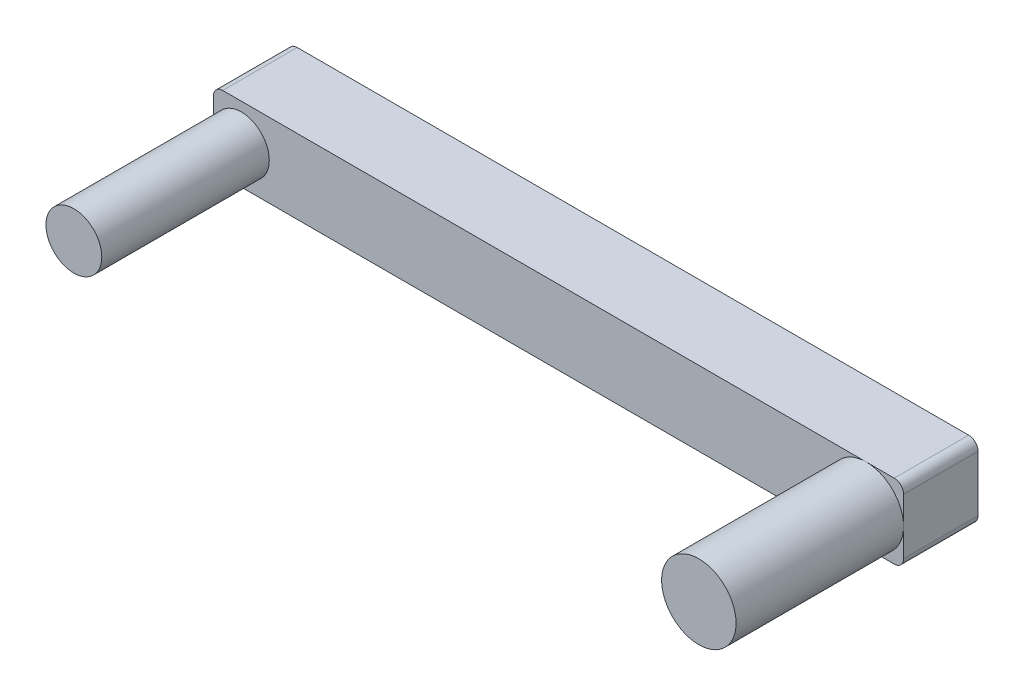
ISO-10303-21;
HEADER;
FILE_DESCRIPTION(('STEP AP214'),'2;1');
FILE_NAME('part.step','',(''),(''),'','','');
FILE_SCHEMA(('AUTOMOTIVE_DESIGN { 1 0 10303 214 1 1 1 1 }'));
ENDSEC;
DATA;
#1=APPLICATION_CONTEXT('core data for automotive mechanical design processes');
#2=APPLICATION_PROTOCOL_DEFINITION('international standard','automotive_design',2000,#1);
#3=PRODUCT_CONTEXT('',#1,'mechanical');
#4=PRODUCT('Part','Part','',(#3));
#5=PRODUCT_RELATED_PRODUCT_CATEGORY('part','',(#4));
#6=PRODUCT_DEFINITION_FORMATION('','',#4);
#7=PRODUCT_DEFINITION_CONTEXT('part definition',#1,'design');
#8=PRODUCT_DEFINITION('design','',#6,#7);
#9=PRODUCT_DEFINITION_SHAPE('','',#8);
#10=(LENGTH_UNIT() NAMED_UNIT(*) SI_UNIT(.MILLI.,.METRE.));
#11=(NAMED_UNIT(*) PLANE_ANGLE_UNIT() SI_UNIT($,.RADIAN.));
#12=(NAMED_UNIT(*) SI_UNIT($,.STERADIAN.) SOLID_ANGLE_UNIT());
#13=UNCERTAINTY_MEASURE_WITH_UNIT(LENGTH_MEASURE(1.E-05),#10,'distance_accuracy_value','');
#14=(GEOMETRIC_REPRESENTATION_CONTEXT(3) GLOBAL_UNCERTAINTY_ASSIGNED_CONTEXT((#13)) GLOBAL_UNIT_ASSIGNED_CONTEXT((#10,
#11,#12)) REPRESENTATION_CONTEXT('',''));
#15=CARTESIAN_POINT('',(0.,0.,0.));
#16=DIRECTION('',(0.,0.,1.));
#17=DIRECTION('',(1.,0.,0.));
#18=AXIS2_PLACEMENT_3D('',#15,#16,#17);
#19=CARTESIAN_POINT('',(0.,0.,-38.));
#20=DIRECTION('',(0.,0.,-1.));
#21=DIRECTION('',(1.,0.,0.));
#22=AXIS2_PLACEMENT_3D('',#19,#20,#21);
#23=PLANE('',#22);
#24=DIRECTION('',(1.,0.,0.));
#25=VECTOR('',#24,1.);
#26=CARTESIAN_POINT('',(0.,0.,-38.));
#27=LINE('',#26,#25);
#28=CARTESIAN_POINT('',(35.08,0.,-38.));
#29=VERTEX_POINT('',#28);
#30=CARTESIAN_POINT('',(36.58,0.,-38.));
#31=VERTEX_POINT('',#30);
#32=EDGE_CURVE('E121',#29,#31,#27,.T.);
#33=ORIENTED_EDGE('',*,*,#32,.F.);
#34=CARTESIAN_POINT('',(35.08,-2.,-38.));
#35=DIRECTION('',(0.,0.,1.));
#36=DIRECTION('',(1.,0.,0.));
#37=AXIS2_PLACEMENT_3D('',#34,#35,#36);
#38=CIRCLE('',#37,2.);
#39=CARTESIAN_POINT('',(37.08,-2.,-38.));
#40=VERTEX_POINT('',#39);
#41=EDGE_CURVE('E143',#40,#29,#38,.T.);
#42=ORIENTED_EDGE('',*,*,#41,.F.);
#43=DIRECTION('',(0.,-1.,0.));
#44=VECTOR('',#43,1.);
#45=CARTESIAN_POINT('',(37.08,0.,-38.));
#46=LINE('',#45,#44);
#47=CARTESIAN_POINT('',(37.08,-0.5,-38.));
#48=VERTEX_POINT('',#47);
#49=EDGE_CURVE('E152',#48,#40,#46,.T.);
#50=ORIENTED_EDGE('',*,*,#49,.F.);
#51=CARTESIAN_POINT('',(36.58,-0.5,-38.));
#52=DIRECTION('',(0.,0.,1.));
#53=DIRECTION('',(1.,0.,0.));
#54=AXIS2_PLACEMENT_3D('',#51,#52,#53);
#55=CIRCLE('',#54,0.5);
#56=EDGE_CURVE('E151',#31,#48,#55,.F.);
#57=ORIENTED_EDGE('',*,*,#56,.F.);
#58=EDGE_LOOP('',(#33,#42,#50,#57));
#59=FACE_BOUND('',#58,.T.);
#60=ADVANCED_FACE('F39',(#59),#23,.F.);
#61=DIRECTION('',(1.,0.,0.));
#62=VECTOR('',#61,1.);
#63=CARTESIAN_POINT('',(0.,-4.,-38.));
#64=LINE('',#63,#62);
#65=CARTESIAN_POINT('',(0.5,-4.,-38.));
#66=VERTEX_POINT('',#65);
#67=CARTESIAN_POINT('',(35.08,-4.,-38.));
#68=VERTEX_POINT('',#67);
#69=EDGE_CURVE('E137',#66,#68,#64,.T.);
#70=ORIENTED_EDGE('',*,*,#69,.T.);
#71=CARTESIAN_POINT('',(35.08,-2.,-38.));
#72=DIRECTION('',(0.,0.,1.));
#73=DIRECTION('',(1.,0.,0.));
#74=AXIS2_PLACEMENT_3D('',#71,#72,#73);
#75=CIRCLE('',#74,2.);
#76=EDGE_CURVE('E132',#29,#68,#75,.T.);
#77=ORIENTED_EDGE('',*,*,#76,.F.);
#78=CARTESIAN_POINT('',(0.5,0.,-38.));
#79=VERTEX_POINT('',#78);
#80=EDGE_CURVE('E116',#79,#29,#27,.T.);
#81=ORIENTED_EDGE('',*,*,#80,.F.);
#82=CARTESIAN_POINT('',(0.5,-0.5,-38.));
#83=DIRECTION('',(0.,0.,1.));
#84=DIRECTION('',(1.,0.,0.));
#85=AXIS2_PLACEMENT_3D('',#82,#83,#84);
#86=CIRCLE('',#85,0.5);
#87=CARTESIAN_POINT('',(0.,-0.5,-38.));
#88=VERTEX_POINT('',#87);
#89=EDGE_CURVE('E162',#88,#79,#86,.F.);
#90=ORIENTED_EDGE('',*,*,#89,.F.);
#91=DIRECTION('',(0.,-1.,0.));
#92=VECTOR('',#91,1.);
#93=CARTESIAN_POINT('',(0.,0.,-38.));
#94=LINE('',#93,#92);
#95=CARTESIAN_POINT('',(0.,-2.,-38.));
#96=VERTEX_POINT('',#95);
#97=EDGE_CURVE('E201',#88,#96,#94,.T.);
#98=ORIENTED_EDGE('',*,*,#97,.T.);
#99=CARTESIAN_POINT('',(1.5,-2.,-38.));
#100=DIRECTION('',(0.,0.,1.));
#101=DIRECTION('',(1.,0.,0.));
#102=AXIS2_PLACEMENT_3D('',#99,#100,#101);
#103=CIRCLE('',#102,1.5);
#104=EDGE_CURVE('E147',#96,#96,#103,.T.);
#105=ORIENTED_EDGE('',*,*,#104,.F.);
#106=CARTESIAN_POINT('',(0.,-3.5,-38.));
#107=VERTEX_POINT('',#106);
#108=EDGE_CURVE('E204',#96,#107,#94,.T.);
#109=ORIENTED_EDGE('',*,*,#108,.T.);
#110=CARTESIAN_POINT('',(0.5,-3.5,-38.));
#111=DIRECTION('',(0.,0.,1.));
#112=DIRECTION('',(1.,0.,0.));
#113=AXIS2_PLACEMENT_3D('',#110,#111,#112);
#114=CIRCLE('',#113,0.5);
#115=EDGE_CURVE('E164',#66,#107,#114,.F.);
#116=ORIENTED_EDGE('',*,*,#115,.F.);
#117=EDGE_LOOP('',(#70,#77,#81,#90,#98,#105,#109,#116));
#118=FACE_BOUND('',#117,.T.);
#119=ADVANCED_FACE('F134',(#118),#23,.F.);
#120=CARTESIAN_POINT('',(0.,0.,-42.));
#121=DIRECTION('',(1.,0.,0.));
#122=DIRECTION('',(0.,0.,1.));
#123=AXIS2_PLACEMENT_3D('',#120,#121,#122);
#124=PLANE('',#123);
#125=ORIENTED_EDGE('',*,*,#108,.F.);
#126=ORIENTED_EDGE('',*,*,#97,.F.);
#127=DIRECTION('',(0.,0.,1.));
#128=VECTOR('',#127,1.);
#129=CARTESIAN_POINT('',(0.,-0.5,-38.));
#130=LINE('',#129,#128);
#131=CARTESIAN_POINT('',(0.,-0.5,-42.));
#132=VERTEX_POINT('',#131);
#133=EDGE_CURVE('E167',#132,#88,#130,.T.);
#134=ORIENTED_EDGE('',*,*,#133,.F.);
#135=DIRECTION('',(0.,-1.,0.));
#136=VECTOR('',#135,1.);
#137=CARTESIAN_POINT('',(0.,0.,-42.));
#138=LINE('',#137,#136);
#139=CARTESIAN_POINT('',(0.,-3.5,-42.));
#140=VERTEX_POINT('',#139);
#141=EDGE_CURVE('E128',#132,#140,#138,.T.);
#142=ORIENTED_EDGE('',*,*,#141,.T.);
#143=DIRECTION('',(0.,0.,1.));
#144=VECTOR('',#143,1.);
#145=CARTESIAN_POINT('',(0.,-3.5,-42.));
#146=LINE('',#145,#144);
#147=EDGE_CURVE('E169',#107,#140,#146,.F.);
#148=ORIENTED_EDGE('',*,*,#147,.F.);
#149=EDGE_LOOP('',(#125,#126,#134,#142,#148));
#150=FACE_BOUND('',#149,.T.);
#151=ADVANCED_FACE('F221',(#150),#124,.F.);
#152=CARTESIAN_POINT('',(0.,-4.,-42.));
#153=DIRECTION('',(0.,1.,0.));
#154=DIRECTION('',(0.,0.,-1.));
#155=AXIS2_PLACEMENT_3D('',#152,#153,#154);
#156=PLANE('',#155);
#157=DIRECTION('',(1.,0.,0.));
#158=VECTOR('',#157,1.);
#159=CARTESIAN_POINT('',(0.,-4.,-42.));
#160=LINE('',#159,#158);
#161=CARTESIAN_POINT('',(0.5,-4.,-42.));
#162=VERTEX_POINT('',#161);
#163=CARTESIAN_POINT('',(36.58,-4.,-42.));
#164=VERTEX_POINT('',#163);
#165=EDGE_CURVE('E194',#162,#164,#160,.T.);
#166=ORIENTED_EDGE('',*,*,#165,.T.);
#167=DIRECTION('',(0.,0.,1.));
#168=VECTOR('',#167,1.);
#169=CARTESIAN_POINT('',(36.58,-4.,-42.));
#170=LINE('',#169,#168);
#171=CARTESIAN_POINT('',(36.58,-4.,-38.));
#172=VERTEX_POINT('',#171);
#173=EDGE_CURVE('E139',#172,#164,#170,.F.);
#174=ORIENTED_EDGE('',*,*,#173,.F.);
#175=EDGE_CURVE('E203',#68,#172,#64,.T.);
#176=ORIENTED_EDGE('',*,*,#175,.F.);
#177=ORIENTED_EDGE('',*,*,#69,.F.);
#178=DIRECTION('',(0.,0.,1.));
#179=VECTOR('',#178,1.);
#180=CARTESIAN_POINT('',(0.5,-4.,-42.));
#181=LINE('',#180,#179);
#182=EDGE_CURVE('E160',#162,#66,#181,.T.);
#183=ORIENTED_EDGE('',*,*,#182,.F.);
#184=EDGE_LOOP('',(#166,#174,#176,#177,#183));
#185=FACE_BOUND('',#184,.T.);
#186=ADVANCED_FACE('F209',(#185),#156,.F.);
#187=CARTESIAN_POINT('',(37.08,0.,-42.));
#188=DIRECTION('',(1.,0.,0.));
#189=DIRECTION('',(0.,0.,1.));
#190=AXIS2_PLACEMENT_3D('',#187,#188,#189);
#191=PLANE('',#190);
#192=ORIENTED_EDGE('',*,*,#49,.T.);
#193=CARTESIAN_POINT('',(37.08,-3.5,-38.));
#194=VERTEX_POINT('',#193);
#195=EDGE_CURVE('E153',#40,#194,#46,.T.);
#196=ORIENTED_EDGE('',*,*,#195,.T.);
#197=DIRECTION('',(0.,0.,1.));
#198=VECTOR('',#197,1.);
#199=CARTESIAN_POINT('',(37.08,-3.5,-38.));
#200=LINE('',#199,#198);
#201=CARTESIAN_POINT('',(37.08,-3.5,-42.));
#202=VERTEX_POINT('',#201);
#203=EDGE_CURVE('E184',#202,#194,#200,.T.);
#204=ORIENTED_EDGE('',*,*,#203,.F.);
#205=DIRECTION('',(0.,-1.,0.));
#206=VECTOR('',#205,1.);
#207=CARTESIAN_POINT('',(37.08,0.,-42.));
#208=LINE('',#207,#206);
#209=CARTESIAN_POINT('',(37.08,-0.5,-42.));
#210=VERTEX_POINT('',#209);
#211=EDGE_CURVE('E190',#210,#202,#208,.T.);
#212=ORIENTED_EDGE('',*,*,#211,.F.);
#213=DIRECTION('',(0.,0.,1.));
#214=VECTOR('',#213,1.);
#215=CARTESIAN_POINT('',(37.08,-0.5,-42.));
#216=LINE('',#215,#214);
#217=EDGE_CURVE('E47',#48,#210,#216,.F.);
#218=ORIENTED_EDGE('',*,*,#217,.F.);
#219=EDGE_LOOP('',(#192,#196,#204,#212,#218));
#220=FACE_BOUND('',#219,.T.);
#221=ADVANCED_FACE('F191',(#220),#191,.T.);
#222=CARTESIAN_POINT('',(0.,0.,-42.));
#223=DIRECTION('',(0.,1.,0.));
#224=DIRECTION('',(0.,0.,-1.));
#225=AXIS2_PLACEMENT_3D('',#222,#223,#224);
#226=PLANE('',#225);
#227=ORIENTED_EDGE('',*,*,#80,.T.);
#228=ORIENTED_EDGE('',*,*,#32,.T.);
#229=DIRECTION('',(0.,0.,1.));
#230=VECTOR('',#229,1.);
#231=CARTESIAN_POINT('',(36.58,0.,-42.));
#232=LINE('',#231,#230);
#233=CARTESIAN_POINT('',(36.58,0.,-42.));
#234=VERTEX_POINT('',#233);
#235=EDGE_CURVE('E180',#234,#31,#232,.T.);
#236=ORIENTED_EDGE('',*,*,#235,.F.);
#237=DIRECTION('',(1.,0.,0.));
#238=VECTOR('',#237,1.);
#239=CARTESIAN_POINT('',(0.,0.,-42.));
#240=LINE('',#239,#238);
#241=CARTESIAN_POINT('',(0.5,0.,-42.));
#242=VERTEX_POINT('',#241);
#243=EDGE_CURVE('E157',#242,#234,#240,.T.);
#244=ORIENTED_EDGE('',*,*,#243,.F.);
#245=DIRECTION('',(0.,0.,1.));
#246=VECTOR('',#245,1.);
#247=CARTESIAN_POINT('',(0.5,0.,-42.));
#248=LINE('',#247,#246);
#249=EDGE_CURVE('E124',#79,#242,#248,.F.);
#250=ORIENTED_EDGE('',*,*,#249,.F.);
#251=EDGE_LOOP('',(#227,#228,#236,#244,#250));
#252=FACE_BOUND('',#251,.T.);
#253=ADVANCED_FACE('F118',(#252),#226,.T.);
#254=CARTESIAN_POINT('',(0.,0.,-42.));
#255=DIRECTION('',(0.,0.,-1.));
#256=DIRECTION('',(1.,0.,0.));
#257=AXIS2_PLACEMENT_3D('',#254,#255,#256);
#258=PLANE('',#257);
#259=ORIENTED_EDGE('',*,*,#141,.F.);
#260=CARTESIAN_POINT('',(0.5,-0.5,-42.));
#261=DIRECTION('',(0.,0.,1.));
#262=DIRECTION('',(1.,0.,0.));
#263=AXIS2_PLACEMENT_3D('',#260,#261,#262);
#264=CIRCLE('',#263,0.5);
#265=EDGE_CURVE('E176',#242,#132,#264,.T.);
#266=ORIENTED_EDGE('',*,*,#265,.F.);
#267=ORIENTED_EDGE('',*,*,#243,.T.);
#268=CARTESIAN_POINT('',(36.58,-0.5,-42.));
#269=DIRECTION('',(0.,0.,1.));
#270=DIRECTION('',(1.,0.,0.));
#271=AXIS2_PLACEMENT_3D('',#268,#269,#270);
#272=CIRCLE('',#271,0.5);
#273=EDGE_CURVE('E174',#210,#234,#272,.T.);
#274=ORIENTED_EDGE('',*,*,#273,.F.);
#275=ORIENTED_EDGE('',*,*,#211,.T.);
#276=CARTESIAN_POINT('',(36.58,-3.5,-42.));
#277=DIRECTION('',(0.,0.,1.));
#278=DIRECTION('',(1.,0.,0.));
#279=AXIS2_PLACEMENT_3D('',#276,#277,#278);
#280=CIRCLE('',#279,0.5);
#281=EDGE_CURVE('E172',#164,#202,#280,.T.);
#282=ORIENTED_EDGE('',*,*,#281,.F.);
#283=ORIENTED_EDGE('',*,*,#165,.F.);
#284=CARTESIAN_POINT('',(0.5,-3.5,-42.));
#285=DIRECTION('',(0.,0.,1.));
#286=DIRECTION('',(1.,0.,0.));
#287=AXIS2_PLACEMENT_3D('',#284,#285,#286);
#288=CIRCLE('',#287,0.5);
#289=EDGE_CURVE('E178',#140,#162,#288,.T.);
#290=ORIENTED_EDGE('',*,*,#289,.F.);
#291=EDGE_LOOP('',(#259,#266,#267,#274,#275,#282,#283,#290));
#292=FACE_BOUND('',#291,.T.);
#293=ADVANCED_FACE('F214',(#292),#258,.T.);
#294=ORIENTED_EDGE('',*,*,#195,.F.);
#295=EDGE_CURVE('E140',#68,#40,#75,.T.);
#296=ORIENTED_EDGE('',*,*,#295,.F.);
#297=ORIENTED_EDGE('',*,*,#175,.T.);
#298=CARTESIAN_POINT('',(36.58,-3.5,-38.));
#299=DIRECTION('',(0.,0.,1.));
#300=DIRECTION('',(1.,0.,0.));
#301=AXIS2_PLACEMENT_3D('',#298,#299,#300);
#302=CIRCLE('',#301,0.5);
#303=EDGE_CURVE('E11',#194,#172,#302,.F.);
#304=ORIENTED_EDGE('',*,*,#303,.F.);
#305=EDGE_LOOP('',(#294,#296,#297,#304));
#306=FACE_BOUND('',#305,.T.);
#307=ADVANCED_FACE('F207',(#306),#23,.F.);
#308=CARTESIAN_POINT('',(1.5,-2.,-29.));
#309=DIRECTION('',(0.,0.,-1.));
#310=DIRECTION('',(1.,0.,0.));
#311=AXIS2_PLACEMENT_3D('',#308,#309,#310);
#312=CYLINDRICAL_SURFACE('',#311,1.5);
#313=CARTESIAN_POINT('',(1.5,-2.,-29.));
#314=DIRECTION('',(0.,0.,1.));
#315=DIRECTION('',(1.,0.,0.));
#316=AXIS2_PLACEMENT_3D('',#313,#314,#315);
#317=CIRCLE('',#316,1.5);
#318=CARTESIAN_POINT('',(3.,-2.,-29.));
#319=VERTEX_POINT('',#318);
#320=EDGE_CURVE('E226',#319,#319,#317,.T.);
#321=ORIENTED_EDGE('',*,*,#320,.F.);
#322=EDGE_LOOP('',(#321));
#323=FACE_BOUND('',#322,.T.);
#324=ORIENTED_EDGE('',*,*,#104,.T.);
#325=EDGE_LOOP('',(#324));
#326=FACE_BOUND('',#325,.T.);
#327=ADVANCED_FACE('F242',(#323,#326),#312,.T.);
#328=CARTESIAN_POINT('',(0.,0.,-29.));
#329=DIRECTION('',(0.,0.,-1.));
#330=DIRECTION('',(1.,0.,0.));
#331=AXIS2_PLACEMENT_3D('',#328,#329,#330);
#332=PLANE('',#331);
#333=ORIENTED_EDGE('',*,*,#320,.T.);
#334=EDGE_LOOP('',(#333));
#335=FACE_BOUND('',#334,.T.);
#336=ADVANCED_FACE('F235',(#335),#332,.F.);
#337=CARTESIAN_POINT('',(35.08,-2.,-29.));
#338=DIRECTION('',(0.,0.,-1.));
#339=DIRECTION('',(1.,0.,0.));
#340=AXIS2_PLACEMENT_3D('',#337,#338,#339);
#341=CYLINDRICAL_SURFACE('',#340,2.);
#342=CARTESIAN_POINT('',(35.08,-2.,-29.));
#343=DIRECTION('',(0.,0.,1.));
#344=DIRECTION('',(1.,0.,0.));
#345=AXIS2_PLACEMENT_3D('',#342,#343,#344);
#346=CIRCLE('',#345,2.);
#347=CARTESIAN_POINT('',(37.08,-2.,-29.));
#348=VERTEX_POINT('',#347);
#349=EDGE_CURVE('E148',#348,#348,#346,.T.);
#350=ORIENTED_EDGE('',*,*,#349,.F.);
#351=EDGE_LOOP('',(#350));
#352=FACE_BOUND('',#351,.T.);
#353=ORIENTED_EDGE('',*,*,#41,.T.);
#354=ORIENTED_EDGE('',*,*,#76,.T.);
#355=ORIENTED_EDGE('',*,*,#295,.T.);
#356=EDGE_LOOP('',(#353,#354,#355));
#357=FACE_BOUND('',#356,.T.);
#358=ADVANCED_FACE('F144',(#352,#357),#341,.T.);
#359=CARTESIAN_POINT('',(0.,0.,-29.));
#360=DIRECTION('',(0.,0.,-1.));
#361=DIRECTION('',(1.,0.,0.));
#362=AXIS2_PLACEMENT_3D('',#359,#360,#361);
#363=PLANE('',#362);
#364=ORIENTED_EDGE('',*,*,#349,.T.);
#365=EDGE_LOOP('',(#364));
#366=FACE_BOUND('',#365,.T.);
#367=ADVANCED_FACE('F232',(#366),#363,.F.);
#368=CARTESIAN_POINT('',(0.5,-3.5,-42.));
#369=DIRECTION('',(0.,0.,1.));
#370=DIRECTION('',(-1.,0.,0.));
#371=AXIS2_PLACEMENT_3D('',#368,#369,#370);
#372=CYLINDRICAL_SURFACE('',#371,0.5);
#373=ORIENTED_EDGE('',*,*,#289,.T.);
#374=ORIENTED_EDGE('',*,*,#182,.T.);
#375=ORIENTED_EDGE('',*,*,#115,.T.);
#376=ORIENTED_EDGE('',*,*,#147,.T.);
#377=EDGE_LOOP('',(#373,#374,#375,#376));
#378=FACE_BOUND('',#377,.T.);
#379=ADVANCED_FACE('F218',(#378),#372,.T.);
#380=CARTESIAN_POINT('',(0.5,-0.5,-42.));
#381=DIRECTION('',(0.,0.,-1.));
#382=DIRECTION('',(1.,0.,0.));
#383=AXIS2_PLACEMENT_3D('',#380,#381,#382);
#384=CYLINDRICAL_SURFACE('',#383,0.5);
#385=ORIENTED_EDGE('',*,*,#265,.T.);
#386=ORIENTED_EDGE('',*,*,#133,.T.);
#387=ORIENTED_EDGE('',*,*,#89,.T.);
#388=ORIENTED_EDGE('',*,*,#249,.T.);
#389=EDGE_LOOP('',(#385,#386,#387,#388));
#390=FACE_BOUND('',#389,.T.);
#391=ADVANCED_FACE('F273',(#390),#384,.T.);
#392=CARTESIAN_POINT('',(36.58,-0.5,-42.));
#393=DIRECTION('',(0.,0.,1.));
#394=DIRECTION('',(-1.,0.,0.));
#395=AXIS2_PLACEMENT_3D('',#392,#393,#394);
#396=CYLINDRICAL_SURFACE('',#395,0.5);
#397=ORIENTED_EDGE('',*,*,#273,.T.);
#398=ORIENTED_EDGE('',*,*,#235,.T.);
#399=ORIENTED_EDGE('',*,*,#56,.T.);
#400=ORIENTED_EDGE('',*,*,#217,.T.);
#401=EDGE_LOOP('',(#397,#398,#399,#400));
#402=FACE_BOUND('',#401,.T.);
#403=ADVANCED_FACE('F186',(#402),#396,.T.);
#404=CARTESIAN_POINT('',(36.58,-3.5,-42.));
#405=DIRECTION('',(0.,0.,-1.));
#406=DIRECTION('',(1.,0.,0.));
#407=AXIS2_PLACEMENT_3D('',#404,#405,#406);
#408=CYLINDRICAL_SURFACE('',#407,0.5);
#409=ORIENTED_EDGE('',*,*,#281,.T.);
#410=ORIENTED_EDGE('',*,*,#203,.T.);
#411=ORIENTED_EDGE('',*,*,#303,.T.);
#412=ORIENTED_EDGE('',*,*,#173,.T.);
#413=EDGE_LOOP('',(#409,#410,#411,#412));
#414=FACE_BOUND('',#413,.T.);
#415=ADVANCED_FACE('F41',(#414),#408,.T.);
#416=CLOSED_SHELL('',(#60,#119,#151,#186,#221,#253,#293,#307,#327,#336,#358,#367,#379,#391,#403,#415));
#417=MANIFOLD_SOLID_BREP('B2',#416);
#418=ADVANCED_BREP_SHAPE_REPRESENTATION('',(#18,#417),#14);
#419=SHAPE_DEFINITION_REPRESENTATION(#9,#418);
ENDSEC;
END-ISO-10303-21;
